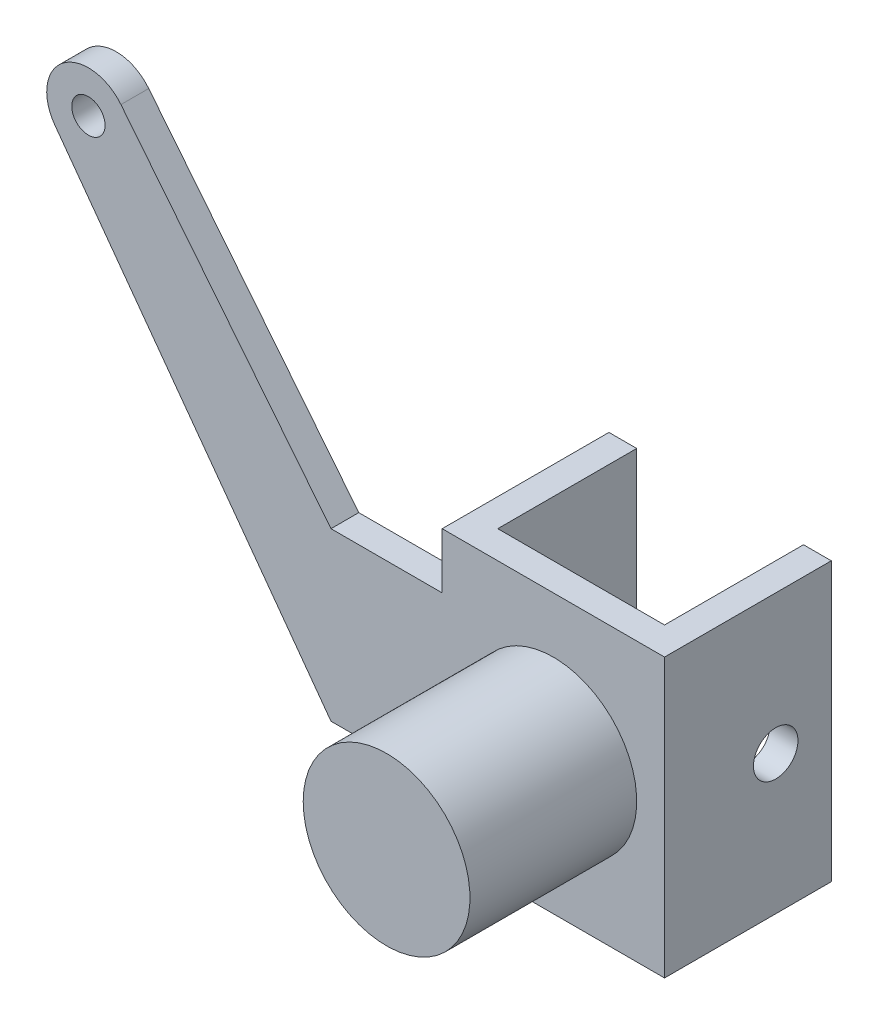
ISO-10303-21;
HEADER;
FILE_DESCRIPTION(('STEP AP214'),'2;1');
FILE_NAME('part.step','',(''),(''),'','','');
FILE_SCHEMA(('AUTOMOTIVE_DESIGN { 1 0 10303 214 1 1 1 1 }'));
ENDSEC;
DATA;
#1=APPLICATION_CONTEXT('core data for automotive mechanical design processes');
#2=APPLICATION_PROTOCOL_DEFINITION('international standard','automotive_design',2000,#1);
#3=PRODUCT_CONTEXT('',#1,'mechanical');
#4=PRODUCT('Part','Part','',(#3));
#5=PRODUCT_RELATED_PRODUCT_CATEGORY('part','',(#4));
#6=PRODUCT_DEFINITION_FORMATION('','',#4);
#7=PRODUCT_DEFINITION_CONTEXT('part definition',#1,'design');
#8=PRODUCT_DEFINITION('design','',#6,#7);
#9=PRODUCT_DEFINITION_SHAPE('','',#8);
#10=(LENGTH_UNIT() NAMED_UNIT(*) SI_UNIT(.MILLI.,.METRE.));
#11=(NAMED_UNIT(*) PLANE_ANGLE_UNIT() SI_UNIT($,.RADIAN.));
#12=(NAMED_UNIT(*) SI_UNIT($,.STERADIAN.) SOLID_ANGLE_UNIT());
#13=UNCERTAINTY_MEASURE_WITH_UNIT(LENGTH_MEASURE(1.E-05),#10,'distance_accuracy_value','');
#14=(GEOMETRIC_REPRESENTATION_CONTEXT(3) GLOBAL_UNCERTAINTY_ASSIGNED_CONTEXT((#13)) GLOBAL_UNIT_ASSIGNED_CONTEXT((#10,
#11,#12)) REPRESENTATION_CONTEXT('',''));
#15=CARTESIAN_POINT('',(0.,0.,0.));
#16=DIRECTION('',(0.,0.,1.));
#17=DIRECTION('',(1.,0.,0.));
#18=AXIS2_PLACEMENT_3D('',#15,#16,#17);
#19=CARTESIAN_POINT('',(-20.,-25.,-65.));
#20=DIRECTION('',(1.,0.,0.));
#21=DIRECTION('',(0.,0.,1.));
#22=AXIS2_PLACEMENT_3D('',#19,#20,#21);
#23=PLANE('',#22);
#24=CARTESIAN_POINT('',(-20.,0.,-80.));
#25=DIRECTION('',(1.,0.,0.));
#26=DIRECTION('',(0.,0.,-1.));
#27=AXIS2_PLACEMENT_3D('',#24,#25,#26);
#28=CIRCLE('',#27,4.);
#29=CARTESIAN_POINT('',(-20.,0.,-84.));
#30=VERTEX_POINT('',#29);
#31=EDGE_CURVE('E172',#30,#30,#28,.T.);
#32=ORIENTED_EDGE('',*,*,#31,.T.);
#33=EDGE_LOOP('',(#32));
#34=FACE_BOUND('',#33,.T.);
#35=DIRECTION('',(0.,0.,1.));
#36=VECTOR('',#35,1.);
#37=CARTESIAN_POINT('',(-20.,15.,-65.));
#38=LINE('',#37,#36);
#39=CARTESIAN_POINT('',(-20.,15.,-65.));
#40=VERTEX_POINT('',#39);
#41=CARTESIAN_POINT('',(-20.,15.,-60.));
#42=VERTEX_POINT('',#41);
#43=EDGE_CURVE('E167',#40,#42,#38,.T.);
#44=ORIENTED_EDGE('',*,*,#43,.T.);
#45=DIRECTION('',(0.,-1.,0.));
#46=VECTOR('',#45,1.);
#47=CARTESIAN_POINT('',(-20.,-25.,-60.));
#48=LINE('',#47,#46);
#49=CARTESIAN_POINT('',(-20.,25.,-60.));
#50=VERTEX_POINT('',#49);
#51=EDGE_CURVE('E161',#50,#42,#48,.T.);
#52=ORIENTED_EDGE('',*,*,#51,.F.);
#53=DIRECTION('',(0.,0.,1.));
#54=VECTOR('',#53,1.);
#55=CARTESIAN_POINT('',(-20.,25.,-65.));
#56=LINE('',#55,#54);
#57=CARTESIAN_POINT('',(-20.,25.,-90.));
#58=VERTEX_POINT('',#57);
#59=EDGE_CURVE('E42',#58,#50,#56,.T.);
#60=ORIENTED_EDGE('',*,*,#59,.F.);
#61=DIRECTION('',(0.,-1.,0.));
#62=VECTOR('',#61,1.);
#63=CARTESIAN_POINT('',(-20.,25.,-90.));
#64=LINE('',#63,#62);
#65=CARTESIAN_POINT('',(-20.,-25.,-90.));
#66=VERTEX_POINT('',#65);
#67=EDGE_CURVE('E199',#58,#66,#64,.T.);
#68=ORIENTED_EDGE('',*,*,#67,.T.);
#69=DIRECTION('',(0.,0.,1.));
#70=VECTOR('',#69,1.);
#71=CARTESIAN_POINT('',(-20.,-25.,-65.));
#72=LINE('',#71,#70);
#73=CARTESIAN_POINT('',(-20.,-25.,-60.));
#74=VERTEX_POINT('',#73);
#75=EDGE_CURVE('E232',#66,#74,#72,.T.);
#76=ORIENTED_EDGE('',*,*,#75,.T.);
#77=CARTESIAN_POINT('',(-20.,-15.,-60.));
#78=VERTEX_POINT('',#77);
#79=EDGE_CURVE('E227',#78,#74,#48,.T.);
#80=ORIENTED_EDGE('',*,*,#79,.F.);
#81=DIRECTION('',(0.,0.,-1.));
#82=VECTOR('',#81,1.);
#83=CARTESIAN_POINT('',(-20.,-15.,-65.));
#84=LINE('',#83,#82);
#85=CARTESIAN_POINT('',(-20.,-15.,-65.));
#86=VERTEX_POINT('',#85);
#87=EDGE_CURVE('E248',#78,#86,#84,.T.);
#88=ORIENTED_EDGE('',*,*,#87,.T.);
#89=DIRECTION('',(0.,1.,0.));
#90=VECTOR('',#89,1.);
#91=CARTESIAN_POINT('',(-20.,-15.,-65.));
#92=LINE('',#91,#90);
#93=EDGE_CURVE('E245',#86,#40,#92,.T.);
#94=ORIENTED_EDGE('',*,*,#93,.T.);
#95=EDGE_LOOP('',(#44,#52,#60,#68,#76,#80,#88,#94));
#96=FACE_BOUND('',#95,.T.);
#97=ADVANCED_FACE('F33',(#34,#96),#23,.F.);
#98=CARTESIAN_POINT('',(0.,0.,-65.));
#99=DIRECTION('',(0.,0.,1.));
#100=DIRECTION('',(-1.,0.,0.));
#101=AXIS2_PLACEMENT_3D('',#98,#99,#100);
#102=PLANE('',#101);
#103=DIRECTION('',(0.,-1.,0.));
#104=VECTOR('',#103,1.);
#105=CARTESIAN_POINT('',(15.,25.,-65.));
#106=LINE('',#105,#104);
#107=CARTESIAN_POINT('',(15.,25.,-65.));
#108=VERTEX_POINT('',#107);
#109=CARTESIAN_POINT('',(15.,-25.,-65.));
#110=VERTEX_POINT('',#109);
#111=EDGE_CURVE('E181',#108,#110,#106,.T.);
#112=ORIENTED_EDGE('',*,*,#111,.T.);
#113=DIRECTION('',(1.,0.,0.));
#114=VECTOR('',#113,1.);
#115=CARTESIAN_POINT('',(-20.,-25.,-65.));
#116=LINE('',#115,#114);
#117=CARTESIAN_POINT('',(-15.,-25.,-65.));
#118=VERTEX_POINT('',#117);
#119=EDGE_CURVE('E219',#118,#110,#116,.T.);
#120=ORIENTED_EDGE('',*,*,#119,.F.);
#121=DIRECTION('',(0.,1.,0.));
#122=VECTOR('',#121,1.);
#123=CARTESIAN_POINT('',(-15.,25.,-65.));
#124=LINE('',#123,#122);
#125=CARTESIAN_POINT('',(-15.,25.,-65.));
#126=VERTEX_POINT('',#125);
#127=EDGE_CURVE('E198',#118,#126,#124,.T.);
#128=ORIENTED_EDGE('',*,*,#127,.T.);
#129=DIRECTION('',(-1.,0.,0.));
#130=VECTOR('',#129,1.);
#131=CARTESIAN_POINT('',(-20.,25.,-65.));
#132=LINE('',#131,#130);
#133=EDGE_CURVE('E216',#108,#126,#132,.T.);
#134=ORIENTED_EDGE('',*,*,#133,.F.);
#135=EDGE_LOOP('',(#112,#120,#128,#134));
#136=FACE_BOUND('',#135,.T.);
#137=ADVANCED_FACE('F288',(#136),#102,.F.);
#138=CARTESIAN_POINT('',(20.,-25.,-65.));
#139=DIRECTION('',(-1.,0.,0.));
#140=DIRECTION('',(0.,0.,-1.));
#141=AXIS2_PLACEMENT_3D('',#138,#139,#140);
#142=PLANE('',#141);
#143=CARTESIAN_POINT('',(20.,0.,-80.));
#144=DIRECTION('',(1.,0.,0.));
#145=DIRECTION('',(0.,0.,-1.));
#146=AXIS2_PLACEMENT_3D('',#143,#144,#145);
#147=CIRCLE('',#146,4.);
#148=CARTESIAN_POINT('',(20.,0.,-84.));
#149=VERTEX_POINT('',#148);
#150=EDGE_CURVE('E173',#149,#149,#147,.T.);
#151=ORIENTED_EDGE('',*,*,#150,.F.);
#152=EDGE_LOOP('',(#151));
#153=FACE_BOUND('',#152,.T.);
#154=DIRECTION('',(0.,1.,0.));
#155=VECTOR('',#154,1.);
#156=CARTESIAN_POINT('',(20.,-25.,-60.));
#157=LINE('',#156,#155);
#158=CARTESIAN_POINT('',(20.,-25.,-60.));
#159=VERTEX_POINT('',#158);
#160=CARTESIAN_POINT('',(20.,25.,-60.));
#161=VERTEX_POINT('',#160);
#162=EDGE_CURVE('E215',#159,#161,#157,.T.);
#163=ORIENTED_EDGE('',*,*,#162,.F.);
#164=DIRECTION('',(0.,0.,1.));
#165=VECTOR('',#164,1.);
#166=CARTESIAN_POINT('',(20.,-25.,-65.));
#167=LINE('',#166,#165);
#168=CARTESIAN_POINT('',(20.,-25.,-90.));
#169=VERTEX_POINT('',#168);
#170=EDGE_CURVE('E223',#169,#159,#167,.T.);
#171=ORIENTED_EDGE('',*,*,#170,.F.);
#172=DIRECTION('',(0.,1.,0.));
#173=VECTOR('',#172,1.);
#174=CARTESIAN_POINT('',(20.,25.,-90.));
#175=LINE('',#174,#173);
#176=CARTESIAN_POINT('',(20.,25.,-90.));
#177=VERTEX_POINT('',#176);
#178=EDGE_CURVE('E182',#169,#177,#175,.T.);
#179=ORIENTED_EDGE('',*,*,#178,.T.);
#180=DIRECTION('',(0.,0.,1.));
#181=VECTOR('',#180,1.);
#182=CARTESIAN_POINT('',(20.,25.,-65.));
#183=LINE('',#182,#181);
#184=EDGE_CURVE('E11',#177,#161,#183,.T.);
#185=ORIENTED_EDGE('',*,*,#184,.T.);
#186=EDGE_LOOP('',(#163,#171,#179,#185));
#187=FACE_BOUND('',#186,.T.);
#188=ADVANCED_FACE('F35',(#153,#187),#142,.F.);
#189=CARTESIAN_POINT('',(-20.,25.,-65.));
#190=DIRECTION('',(0.,-1.,0.));
#191=DIRECTION('',(0.,0.,1.));
#192=AXIS2_PLACEMENT_3D('',#189,#190,#191);
#193=PLANE('',#192);
#194=DIRECTION('',(-1.,0.,0.));
#195=VECTOR('',#194,1.);
#196=CARTESIAN_POINT('',(-20.,25.,-60.));
#197=LINE('',#196,#195);
#198=EDGE_CURVE('E225',#161,#50,#197,.T.);
#199=ORIENTED_EDGE('',*,*,#198,.F.);
#200=ORIENTED_EDGE('',*,*,#184,.F.);
#201=DIRECTION('',(-1.,0.,0.));
#202=VECTOR('',#201,1.);
#203=CARTESIAN_POINT('',(20.,25.,-90.));
#204=LINE('',#203,#202);
#205=CARTESIAN_POINT('',(15.,25.,-90.));
#206=VERTEX_POINT('',#205);
#207=EDGE_CURVE('E185',#177,#206,#204,.T.);
#208=ORIENTED_EDGE('',*,*,#207,.T.);
#209=DIRECTION('',(0.,0.,1.));
#210=VECTOR('',#209,1.);
#211=CARTESIAN_POINT('',(15.,25.,-90.));
#212=LINE('',#211,#210);
#213=EDGE_CURVE('E196',#206,#108,#212,.T.);
#214=ORIENTED_EDGE('',*,*,#213,.T.);
#215=ORIENTED_EDGE('',*,*,#133,.T.);
#216=DIRECTION('',(0.,0.,1.));
#217=VECTOR('',#216,1.);
#218=CARTESIAN_POINT('',(-15.,25.,-90.));
#219=LINE('',#218,#217);
#220=CARTESIAN_POINT('',(-15.,25.,-90.));
#221=VERTEX_POINT('',#220);
#222=EDGE_CURVE('E209',#221,#126,#219,.T.);
#223=ORIENTED_EDGE('',*,*,#222,.F.);
#224=DIRECTION('',(-1.,0.,0.));
#225=VECTOR('',#224,1.);
#226=CARTESIAN_POINT('',(-20.,25.,-90.));
#227=LINE('',#226,#225);
#228=EDGE_CURVE('E207',#221,#58,#227,.T.);
#229=ORIENTED_EDGE('',*,*,#228,.T.);
#230=ORIENTED_EDGE('',*,*,#59,.T.);
#231=EDGE_LOOP('',(#199,#200,#208,#214,#215,#223,#229,#230));
#232=FACE_BOUND('',#231,.T.);
#233=ADVANCED_FACE('F238',(#232),#193,.F.);
#234=CARTESIAN_POINT('',(-20.,-25.,-65.));
#235=DIRECTION('',(0.,1.,0.));
#236=DIRECTION('',(0.,0.,-1.));
#237=AXIS2_PLACEMENT_3D('',#234,#235,#236);
#238=PLANE('',#237);
#239=DIRECTION('',(1.,0.,0.));
#240=VECTOR('',#239,1.);
#241=CARTESIAN_POINT('',(-20.,-25.,-60.));
#242=LINE('',#241,#240);
#243=EDGE_CURVE('E220',#74,#159,#242,.T.);
#244=ORIENTED_EDGE('',*,*,#243,.F.);
#245=ORIENTED_EDGE('',*,*,#75,.F.);
#246=DIRECTION('',(1.,0.,0.));
#247=VECTOR('',#246,1.);
#248=CARTESIAN_POINT('',(-20.,-25.,-90.));
#249=LINE('',#248,#247);
#250=CARTESIAN_POINT('',(-15.,-25.,-90.));
#251=VERTEX_POINT('',#250);
#252=EDGE_CURVE('E202',#66,#251,#249,.T.);
#253=ORIENTED_EDGE('',*,*,#252,.T.);
#254=DIRECTION('',(0.,0.,1.));
#255=VECTOR('',#254,1.);
#256=CARTESIAN_POINT('',(-15.,-25.,-90.));
#257=LINE('',#256,#255);
#258=EDGE_CURVE('E213',#251,#118,#257,.T.);
#259=ORIENTED_EDGE('',*,*,#258,.T.);
#260=ORIENTED_EDGE('',*,*,#119,.T.);
#261=DIRECTION('',(0.,0.,1.));
#262=VECTOR('',#261,1.);
#263=CARTESIAN_POINT('',(15.,-25.,-90.));
#264=LINE('',#263,#262);
#265=CARTESIAN_POINT('',(15.,-25.,-90.));
#266=VERTEX_POINT('',#265);
#267=EDGE_CURVE('E192',#266,#110,#264,.T.);
#268=ORIENTED_EDGE('',*,*,#267,.F.);
#269=DIRECTION('',(1.,0.,0.));
#270=VECTOR('',#269,1.);
#271=CARTESIAN_POINT('',(20.,-25.,-90.));
#272=LINE('',#271,#270);
#273=EDGE_CURVE('E190',#266,#169,#272,.T.);
#274=ORIENTED_EDGE('',*,*,#273,.T.);
#275=ORIENTED_EDGE('',*,*,#170,.T.);
#276=EDGE_LOOP('',(#244,#245,#253,#259,#260,#268,#274,#275));
#277=FACE_BOUND('',#276,.T.);
#278=ADVANCED_FACE('F297',(#277),#238,.F.);
#279=CARTESIAN_POINT('',(0.,0.,-60.));
#280=DIRECTION('',(0.,0.,1.));
#281=DIRECTION('',(-1.,0.,0.));
#282=AXIS2_PLACEMENT_3D('',#279,#280,#281);
#283=PLANE('',#282);
#284=CARTESIAN_POINT('',(0.,0.,-60.));
#285=DIRECTION('',(0.,0.,-1.));
#286=DIRECTION('',(-1.,0.,0.));
#287=AXIS2_PLACEMENT_3D('',#284,#285,#286);
#288=CIRCLE('',#287,15.);
#289=CARTESIAN_POINT('',(-15.,0.,-60.));
#290=VERTEX_POINT('',#289);
#291=EDGE_CURVE('E270',#290,#290,#288,.T.);
#292=ORIENTED_EDGE('',*,*,#291,.T.);
#293=EDGE_LOOP('',(#292));
#294=FACE_BOUND('',#293,.T.);
#295=ORIENTED_EDGE('',*,*,#162,.T.);
#296=ORIENTED_EDGE('',*,*,#198,.T.);
#297=ORIENTED_EDGE('',*,*,#51,.T.);
#298=DIRECTION('',(1.,0.,0.));
#299=VECTOR('',#298,1.);
#300=CARTESIAN_POINT('',(-40.,15.,-60.));
#301=LINE('',#300,#299);
#302=CARTESIAN_POINT('',(-40.,15.,-60.));
#303=VERTEX_POINT('',#302);
#304=EDGE_CURVE('E142',#303,#42,#301,.T.);
#305=ORIENTED_EDGE('',*,*,#304,.F.);
#306=DIRECTION('',(-0.625122229038169,0.780526872543381,0.));
#307=VECTOR('',#306,1.);
#308=CARTESIAN_POINT('',(-40.,15.,-60.));
#309=LINE('',#308,#307);
#310=CARTESIAN_POINT('',(-77.7858947627863,62.179423311869,-60.));
#311=VERTEX_POINT('',#310);
#312=EDGE_CURVE('E149',#303,#311,#309,.T.);
#313=ORIENTED_EDGE('',*,*,#312,.T.);
#314=CARTESIAN_POINT('',(-83.6398463068617,57.4910065940827,-60.));
#315=DIRECTION('',(0.,0.,1.));
#316=DIRECTION('',(1.,0.,0.));
#317=AXIS2_PLACEMENT_3D('',#314,#315,#316);
#318=CIRCLE('',#317,7.50000000000009);
#319=CARTESIAN_POINT('',(-89.6971941545982,53.0685031117185,-60.));
#320=VERTEX_POINT('',#319);
#321=EDGE_CURVE('E154',#311,#320,#318,.T.);
#322=ORIENTED_EDGE('',*,*,#321,.T.);
#323=DIRECTION('',(0.589667130981892,-0.807646379698185,0.));
#324=VECTOR('',#323,1.);
#325=CARTESIAN_POINT('',(-89.6971941545982,53.0685031117185,-60.));
#326=LINE('',#325,#324);
#327=CARTESIAN_POINT('',(-40.,-15.,-60.));
#328=VERTEX_POINT('',#327);
#329=EDGE_CURVE('E253',#320,#328,#326,.T.);
#330=ORIENTED_EDGE('',*,*,#329,.T.);
#331=DIRECTION('',(1.,0.,0.));
#332=VECTOR('',#331,1.);
#333=CARTESIAN_POINT('',(-40.,-15.,-60.));
#334=LINE('',#333,#332);
#335=EDGE_CURVE('E57',#328,#78,#334,.T.);
#336=ORIENTED_EDGE('',*,*,#335,.T.);
#337=ORIENTED_EDGE('',*,*,#79,.T.);
#338=ORIENTED_EDGE('',*,*,#243,.T.);
#339=EDGE_LOOP('',(#295,#296,#297,#305,#313,#322,#330,#336,#337,#338));
#340=FACE_BOUND('',#339,.T.);
#341=CARTESIAN_POINT('',(-83.6398463068617,57.4910065940827,-60.));
#342=DIRECTION('',(0.,0.,1.));
#343=DIRECTION('',(1.,0.,0.));
#344=AXIS2_PLACEMENT_3D('',#341,#342,#343);
#345=CIRCLE('',#344,3.00000000000526);
#346=CARTESIAN_POINT('',(-80.6398463068565,57.4910065940827,-60.));
#347=VERTEX_POINT('',#346);
#348=EDGE_CURVE('E261',#347,#347,#345,.T.);
#349=ORIENTED_EDGE('',*,*,#348,.F.);
#350=EDGE_LOOP('',(#349));
#351=FACE_BOUND('',#350,.T.);
#352=ADVANCED_FACE('F158',(#294,#340,#351),#283,.T.);
#353=CARTESIAN_POINT('',(-15.,25.,-90.));
#354=DIRECTION('',(-1.,0.,0.));
#355=DIRECTION('',(0.,-1.,0.));
#356=AXIS2_PLACEMENT_3D('',#353,#354,#355);
#357=PLANE('',#356);
#358=CARTESIAN_POINT('',(-15.,0.,-80.));
#359=DIRECTION('',(1.,0.,0.));
#360=DIRECTION('',(0.,-1.,0.));
#361=AXIS2_PLACEMENT_3D('',#358,#359,#360);
#362=CIRCLE('',#361,4.);
#363=CARTESIAN_POINT('',(-15.,-4.,-80.));
#364=VERTEX_POINT('',#363);
#365=EDGE_CURVE('E178',#364,#364,#362,.T.);
#366=ORIENTED_EDGE('',*,*,#365,.F.);
#367=EDGE_LOOP('',(#366));
#368=FACE_BOUND('',#367,.T.);
#369=ORIENTED_EDGE('',*,*,#127,.F.);
#370=ORIENTED_EDGE('',*,*,#258,.F.);
#371=DIRECTION('',(0.,1.,0.));
#372=VECTOR('',#371,1.);
#373=CARTESIAN_POINT('',(-15.,25.,-90.));
#374=LINE('',#373,#372);
#375=EDGE_CURVE('E205',#251,#221,#374,.T.);
#376=ORIENTED_EDGE('',*,*,#375,.T.);
#377=ORIENTED_EDGE('',*,*,#222,.T.);
#378=EDGE_LOOP('',(#369,#370,#376,#377));
#379=FACE_BOUND('',#378,.T.);
#380=ADVANCED_FACE('F328',(#368,#379),#357,.F.);
#381=CARTESIAN_POINT('',(0.,0.,-90.));
#382=DIRECTION('',(0.,0.,-1.));
#383=DIRECTION('',(1.,0.,0.));
#384=AXIS2_PLACEMENT_3D('',#381,#382,#383);
#385=PLANE('',#384);
#386=ORIENTED_EDGE('',*,*,#67,.F.);
#387=ORIENTED_EDGE('',*,*,#228,.F.);
#388=ORIENTED_EDGE('',*,*,#375,.F.);
#389=ORIENTED_EDGE('',*,*,#252,.F.);
#390=EDGE_LOOP('',(#386,#387,#388,#389));
#391=FACE_BOUND('',#390,.T.);
#392=ADVANCED_FACE('F330',(#391),#385,.T.);
#393=CARTESIAN_POINT('',(15.,25.,-90.));
#394=DIRECTION('',(1.,0.,0.));
#395=DIRECTION('',(0.,1.,0.));
#396=AXIS2_PLACEMENT_3D('',#393,#394,#395);
#397=PLANE('',#396);
#398=CARTESIAN_POINT('',(15.,0.,-80.));
#399=DIRECTION('',(-1.,0.,0.));
#400=DIRECTION('',(0.,1.,0.));
#401=AXIS2_PLACEMENT_3D('',#398,#399,#400);
#402=CIRCLE('',#401,4.);
#403=CARTESIAN_POINT('',(15.,4.,-80.));
#404=VERTEX_POINT('',#403);
#405=EDGE_CURVE('E37',#404,#404,#402,.T.);
#406=ORIENTED_EDGE('',*,*,#405,.F.);
#407=EDGE_LOOP('',(#406));
#408=FACE_BOUND('',#407,.T.);
#409=ORIENTED_EDGE('',*,*,#111,.F.);
#410=ORIENTED_EDGE('',*,*,#213,.F.);
#411=DIRECTION('',(0.,-1.,0.));
#412=VECTOR('',#411,1.);
#413=CARTESIAN_POINT('',(15.,25.,-90.));
#414=LINE('',#413,#412);
#415=EDGE_CURVE('E188',#206,#266,#414,.T.);
#416=ORIENTED_EDGE('',*,*,#415,.T.);
#417=ORIENTED_EDGE('',*,*,#267,.T.);
#418=EDGE_LOOP('',(#409,#410,#416,#417));
#419=FACE_BOUND('',#418,.T.);
#420=ADVANCED_FACE('F325',(#408,#419),#397,.F.);
#421=CARTESIAN_POINT('',(0.,0.,-90.));
#422=DIRECTION('',(0.,0.,1.));
#423=DIRECTION('',(-1.,0.,0.));
#424=AXIS2_PLACEMENT_3D('',#421,#422,#423);
#425=PLANE('',#424);
#426=ORIENTED_EDGE('',*,*,#178,.F.);
#427=ORIENTED_EDGE('',*,*,#273,.F.);
#428=ORIENTED_EDGE('',*,*,#415,.F.);
#429=ORIENTED_EDGE('',*,*,#207,.F.);
#430=EDGE_LOOP('',(#426,#427,#428,#429));
#431=FACE_BOUND('',#430,.T.);
#432=ADVANCED_FACE('F318',(#431),#425,.F.);
#433=CARTESIAN_POINT('',(20.,0.,-80.));
#434=DIRECTION('',(-1.,0.,0.));
#435=DIRECTION('',(0.,0.,-1.));
#436=AXIS2_PLACEMENT_3D('',#433,#434,#435);
#437=CYLINDRICAL_SURFACE('',#436,4.);
#438=ORIENTED_EDGE('',*,*,#150,.T.);
#439=EDGE_LOOP('',(#438));
#440=FACE_BOUND('',#439,.T.);
#441=ORIENTED_EDGE('',*,*,#405,.T.);
#442=EDGE_LOOP('',(#441));
#443=FACE_BOUND('',#442,.T.);
#444=ADVANCED_FACE('F364',(#440,#443),#437,.F.);
#445=ORIENTED_EDGE('',*,*,#31,.F.);
#446=EDGE_LOOP('',(#445));
#447=FACE_BOUND('',#446,.T.);
#448=ORIENTED_EDGE('',*,*,#365,.T.);
#449=EDGE_LOOP('',(#448));
#450=FACE_BOUND('',#449,.T.);
#451=ADVANCED_FACE('F361',(#447,#450),#437,.F.);
#452=CARTESIAN_POINT('',(-40.,-15.,-65.));
#453=DIRECTION('',(0.,1.,0.));
#454=DIRECTION('',(0.,0.,-1.));
#455=AXIS2_PLACEMENT_3D('',#452,#453,#454);
#456=PLANE('',#455);
#457=ORIENTED_EDGE('',*,*,#87,.F.);
#458=ORIENTED_EDGE('',*,*,#335,.F.);
#459=DIRECTION('',(0.,0.,-1.));
#460=VECTOR('',#459,1.);
#461=CARTESIAN_POINT('',(-40.,-15.,-65.));
#462=LINE('',#461,#460);
#463=CARTESIAN_POINT('',(-40.,-15.,-65.));
#464=VERTEX_POINT('',#463);
#465=EDGE_CURVE('E146',#328,#464,#462,.T.);
#466=ORIENTED_EDGE('',*,*,#465,.T.);
#467=DIRECTION('',(1.,0.,0.));
#468=VECTOR('',#467,1.);
#469=CARTESIAN_POINT('',(-40.,-15.,-65.));
#470=LINE('',#469,#468);
#471=EDGE_CURVE('E164',#464,#86,#470,.T.);
#472=ORIENTED_EDGE('',*,*,#471,.T.);
#473=EDGE_LOOP('',(#457,#458,#466,#472));
#474=FACE_BOUND('',#473,.T.);
#475=ADVANCED_FACE('F332',(#474),#456,.F.);
#476=CARTESIAN_POINT('',(-40.,-15.,-65.));
#477=DIRECTION('',(0.,0.,1.));
#478=DIRECTION('',(0.,1.,0.));
#479=AXIS2_PLACEMENT_3D('',#476,#477,#478);
#480=PLANE('',#479);
#481=ORIENTED_EDGE('',*,*,#93,.F.);
#482=ORIENTED_EDGE('',*,*,#471,.F.);
#483=DIRECTION('',(0.589667130981892,-0.807646379698185,0.));
#484=VECTOR('',#483,1.);
#485=CARTESIAN_POINT('',(-89.6971941545982,53.0685031117185,-65.));
#486=LINE('',#485,#484);
#487=CARTESIAN_POINT('',(-89.6971941545982,53.0685031117185,-65.));
#488=VERTEX_POINT('',#487);
#489=EDGE_CURVE('E155',#488,#464,#486,.T.);
#490=ORIENTED_EDGE('',*,*,#489,.F.);
#491=CARTESIAN_POINT('',(-83.6398463068617,57.4910065940827,-65.));
#492=DIRECTION('',(0.,0.,1.));
#493=DIRECTION('',(1.,0.,0.));
#494=AXIS2_PLACEMENT_3D('',#491,#492,#493);
#495=CIRCLE('',#494,7.50000000000009);
#496=CARTESIAN_POINT('',(-77.7858947627863,62.179423311869,-65.));
#497=VERTEX_POINT('',#496);
#498=EDGE_CURVE('E256',#497,#488,#495,.T.);
#499=ORIENTED_EDGE('',*,*,#498,.F.);
#500=DIRECTION('',(-0.625122229038169,0.780526872543381,0.));
#501=VECTOR('',#500,1.);
#502=CARTESIAN_POINT('',(-40.,15.,-65.));
#503=LINE('',#502,#501);
#504=CARTESIAN_POINT('',(-40.,15.,-65.));
#505=VERTEX_POINT('',#504);
#506=EDGE_CURVE('E259',#505,#497,#503,.T.);
#507=ORIENTED_EDGE('',*,*,#506,.F.);
#508=DIRECTION('',(1.,0.,0.));
#509=VECTOR('',#508,1.);
#510=CARTESIAN_POINT('',(-40.,15.,-65.));
#511=LINE('',#510,#509);
#512=EDGE_CURVE('E49',#505,#40,#511,.T.);
#513=ORIENTED_EDGE('',*,*,#512,.T.);
#514=EDGE_LOOP('',(#481,#482,#490,#499,#507,#513));
#515=FACE_BOUND('',#514,.T.);
#516=CARTESIAN_POINT('',(-83.6398463068617,57.4910065940827,-65.));
#517=DIRECTION('',(0.,0.,1.));
#518=DIRECTION('',(1.,0.,0.));
#519=AXIS2_PLACEMENT_3D('',#516,#517,#518);
#520=CIRCLE('',#519,3.00000000000526);
#521=CARTESIAN_POINT('',(-80.6398463068565,57.4910065940827,-65.));
#522=VERTEX_POINT('',#521);
#523=EDGE_CURVE('E264',#522,#522,#520,.T.);
#524=ORIENTED_EDGE('',*,*,#523,.T.);
#525=EDGE_LOOP('',(#524));
#526=FACE_BOUND('',#525,.T.);
#527=ADVANCED_FACE('F335',(#515,#526),#480,.F.);
#528=CARTESIAN_POINT('',(-40.,15.,-65.));
#529=DIRECTION('',(0.,-1.,0.));
#530=DIRECTION('',(0.,0.,1.));
#531=AXIS2_PLACEMENT_3D('',#528,#529,#530);
#532=PLANE('',#531);
#533=ORIENTED_EDGE('',*,*,#43,.F.);
#534=ORIENTED_EDGE('',*,*,#512,.F.);
#535=DIRECTION('',(0.,0.,1.));
#536=VECTOR('',#535,1.);
#537=CARTESIAN_POINT('',(-40.,15.,-65.));
#538=LINE('',#537,#536);
#539=EDGE_CURVE('E137',#505,#303,#538,.T.);
#540=ORIENTED_EDGE('',*,*,#539,.T.);
#541=ORIENTED_EDGE('',*,*,#304,.T.);
#542=EDGE_LOOP('',(#533,#534,#540,#541));
#543=FACE_BOUND('',#542,.T.);
#544=ADVANCED_FACE('F140',(#543),#532,.F.);
#545=CARTESIAN_POINT('',(-89.6971941545982,53.0685031117185,-60.));
#546=DIRECTION('',(-0.807646379698185,-0.589667130981892,0.));
#547=DIRECTION('',(0.589667130981892,-0.807646379698185,0.));
#548=AXIS2_PLACEMENT_3D('',#545,#546,#547);
#549=PLANE('',#548);
#550=ORIENTED_EDGE('',*,*,#489,.T.);
#551=ORIENTED_EDGE('',*,*,#465,.F.);
#552=ORIENTED_EDGE('',*,*,#329,.F.);
#553=DIRECTION('',(0.,0.,-1.));
#554=VECTOR('',#553,1.);
#555=CARTESIAN_POINT('',(-89.6971941545982,53.0685031117185,-60.));
#556=LINE('',#555,#554);
#557=EDGE_CURVE('E249',#320,#488,#556,.T.);
#558=ORIENTED_EDGE('',*,*,#557,.T.);
#559=EDGE_LOOP('',(#550,#551,#552,#558));
#560=FACE_BOUND('',#559,.T.);
#561=ADVANCED_FACE('F350',(#560),#549,.T.);
#562=CARTESIAN_POINT('',(-83.6398463068617,57.4910065940827,-60.));
#563=DIRECTION('',(0.,0.,-1.));
#564=DIRECTION('',(1.,0.,0.));
#565=AXIS2_PLACEMENT_3D('',#562,#563,#564);
#566=CYLINDRICAL_SURFACE('',#565,7.50000000000009);
#567=ORIENTED_EDGE('',*,*,#498,.T.);
#568=ORIENTED_EDGE('',*,*,#557,.F.);
#569=ORIENTED_EDGE('',*,*,#321,.F.);
#570=DIRECTION('',(0.,0.,-1.));
#571=VECTOR('',#570,1.);
#572=CARTESIAN_POINT('',(-77.7858947627863,62.179423311869,-60.));
#573=LINE('',#572,#571);
#574=EDGE_CURVE('E151',#311,#497,#573,.T.);
#575=ORIENTED_EDGE('',*,*,#574,.T.);
#576=EDGE_LOOP('',(#567,#568,#569,#575));
#577=FACE_BOUND('',#576,.T.);
#578=ADVANCED_FACE('F347',(#577),#566,.T.);
#579=CARTESIAN_POINT('',(-40.,15.,-60.));
#580=DIRECTION('',(0.780526872543381,0.625122229038169,0.));
#581=DIRECTION('',(-0.625122229038169,0.780526872543381,0.));
#582=AXIS2_PLACEMENT_3D('',#579,#580,#581);
#583=PLANE('',#582);
#584=ORIENTED_EDGE('',*,*,#506,.T.);
#585=ORIENTED_EDGE('',*,*,#574,.F.);
#586=ORIENTED_EDGE('',*,*,#312,.F.);
#587=ORIENTED_EDGE('',*,*,#539,.F.);
#588=EDGE_LOOP('',(#584,#585,#586,#587));
#589=FACE_BOUND('',#588,.T.);
#590=ADVANCED_FACE('F150',(#589),#583,.T.);
#591=CARTESIAN_POINT('',(-83.6398463068617,57.4910065940827,-60.));
#592=DIRECTION('',(0.,0.,-1.));
#593=DIRECTION('',(1.,0.,0.));
#594=AXIS2_PLACEMENT_3D('',#591,#592,#593);
#595=CYLINDRICAL_SURFACE('',#594,3.00000000000526);
#596=ORIENTED_EDGE('',*,*,#348,.T.);
#597=EDGE_LOOP('',(#596));
#598=FACE_BOUND('',#597,.T.);
#599=ORIENTED_EDGE('',*,*,#523,.F.);
#600=EDGE_LOOP('',(#599));
#601=FACE_BOUND('',#600,.T.);
#602=ADVANCED_FACE('F285',(#598,#601),#595,.F.);
#603=CARTESIAN_POINT('',(0.,0.,-30.));
#604=DIRECTION('',(0.,0.,-1.));
#605=DIRECTION('',(1.,0.,0.));
#606=AXIS2_PLACEMENT_3D('',#603,#604,#605);
#607=CYLINDRICAL_SURFACE('',#606,15.);
#608=CARTESIAN_POINT('',(0.,0.,-30.));
#609=DIRECTION('',(0.,0.,-1.));
#610=DIRECTION('',(-1.,0.,0.));
#611=AXIS2_PLACEMENT_3D('',#608,#609,#610);
#612=CIRCLE('',#611,15.);
#613=CARTESIAN_POINT('',(-15.,0.,-30.));
#614=VERTEX_POINT('',#613);
#615=EDGE_CURVE('E267',#614,#614,#612,.T.);
#616=ORIENTED_EDGE('',*,*,#615,.T.);
#617=EDGE_LOOP('',(#616));
#618=FACE_BOUND('',#617,.T.);
#619=ORIENTED_EDGE('',*,*,#291,.F.);
#620=EDGE_LOOP('',(#619));
#621=FACE_BOUND('',#620,.T.);
#622=ADVANCED_FACE('F276',(#618,#621),#607,.T.);
#623=CARTESIAN_POINT('',(0.,0.,-30.));
#624=DIRECTION('',(0.,0.,1.));
#625=DIRECTION('',(-1.,0.,0.));
#626=AXIS2_PLACEMENT_3D('',#623,#624,#625);
#627=PLANE('',#626);
#628=ORIENTED_EDGE('',*,*,#615,.F.);
#629=EDGE_LOOP('',(#628));
#630=FACE_BOUND('',#629,.T.);
#631=ADVANCED_FACE('F279',(#630),#627,.T.);
#632=CLOSED_SHELL('',(#97,#137,#188,#233,#278,#352,#380,#392,#420,#432,#444,#451,#475,#527,#544,
#561,#578,#590,#602,#622,#631));
#633=MANIFOLD_SOLID_BREP('B2',#632);
#634=ADVANCED_BREP_SHAPE_REPRESENTATION('',(#18,#633),#14);
#635=SHAPE_DEFINITION_REPRESENTATION(#9,#634);
ENDSEC;
END-ISO-10303-21;
